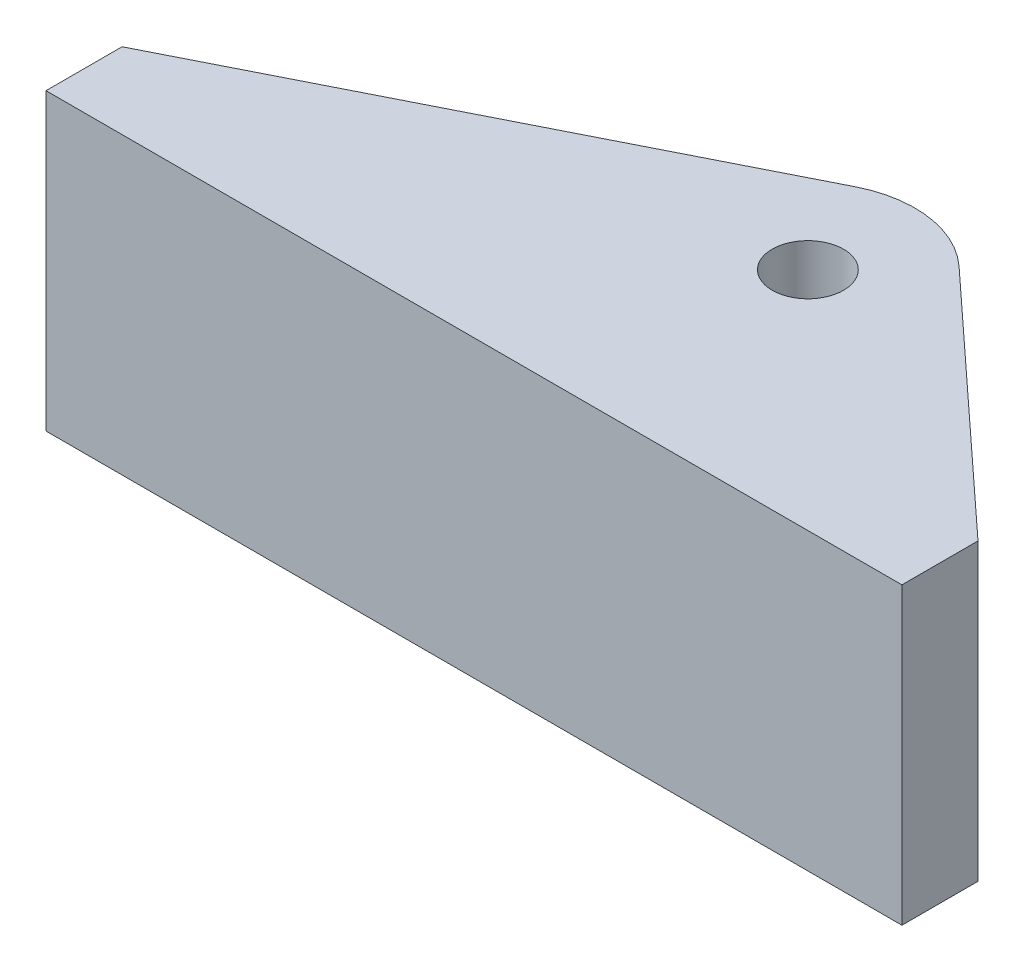
ISO-10303-21;
HEADER;
FILE_DESCRIPTION(('STEP AP214'),'2;1');
FILE_NAME('part.step','',(''),(''),'','','');
FILE_SCHEMA(('AUTOMOTIVE_DESIGN { 1 0 10303 214 1 1 1 1 }'));
ENDSEC;
DATA;
#1=APPLICATION_CONTEXT('core data for automotive mechanical design processes');
#2=APPLICATION_PROTOCOL_DEFINITION('international standard','automotive_design',2000,#1);
#3=PRODUCT_CONTEXT('',#1,'mechanical');
#4=PRODUCT('Part','Part','',(#3));
#5=PRODUCT_RELATED_PRODUCT_CATEGORY('part','',(#4));
#6=PRODUCT_DEFINITION_FORMATION('','',#4);
#7=PRODUCT_DEFINITION_CONTEXT('part definition',#1,'design');
#8=PRODUCT_DEFINITION('design','',#6,#7);
#9=PRODUCT_DEFINITION_SHAPE('','',#8);
#10=(LENGTH_UNIT() NAMED_UNIT(*) SI_UNIT(.MILLI.,.METRE.));
#11=(NAMED_UNIT(*) PLANE_ANGLE_UNIT() SI_UNIT($,.RADIAN.));
#12=(NAMED_UNIT(*) SI_UNIT($,.STERADIAN.) SOLID_ANGLE_UNIT());
#13=UNCERTAINTY_MEASURE_WITH_UNIT(LENGTH_MEASURE(1.E-05),#10,'distance_accuracy_value','');
#14=(GEOMETRIC_REPRESENTATION_CONTEXT(3) GLOBAL_UNCERTAINTY_ASSIGNED_CONTEXT((#13)) GLOBAL_UNIT_ASSIGNED_CONTEXT((#10,
#11,#12)) REPRESENTATION_CONTEXT('',''));
#15=CARTESIAN_POINT('',(0.,0.,0.));
#16=DIRECTION('',(0.,0.,1.));
#17=DIRECTION('',(1.,0.,0.));
#18=AXIS2_PLACEMENT_3D('',#15,#16,#17);
#19=CARTESIAN_POINT('',(0.,-19.685,0.));
#20=DIRECTION('',(-1.,0.,0.));
#21=DIRECTION('',(0.,0.,1.));
#22=AXIS2_PLACEMENT_3D('',#19,#20,#21);
#23=PLANE('',#22);
#24=DIRECTION('',(0.,0.,1.));
#25=VECTOR('',#24,1.);
#26=CARTESIAN_POINT('',(0.,0.,0.));
#27=LINE('',#26,#25);
#28=CARTESIAN_POINT('',(0.,0.,-5.08));
#29=VERTEX_POINT('',#28);
#30=CARTESIAN_POINT('',(0.,0.,0.));
#31=VERTEX_POINT('',#30);
#32=EDGE_CURVE('E136',#29,#31,#27,.T.);
#33=ORIENTED_EDGE('',*,*,#32,.F.);
#34=DIRECTION('',(0.,1.,0.));
#35=VECTOR('',#34,1.);
#36=CARTESIAN_POINT('',(0.,-19.685,-5.08));
#37=LINE('',#36,#35);
#38=CARTESIAN_POINT('',(0.,-19.685,-5.08));
#39=VERTEX_POINT('',#38);
#40=EDGE_CURVE('E11',#39,#29,#37,.T.);
#41=ORIENTED_EDGE('',*,*,#40,.F.);
#42=DIRECTION('',(0.,0.,1.));
#43=VECTOR('',#42,1.);
#44=CARTESIAN_POINT('',(0.,-19.685,0.));
#45=LINE('',#44,#43);
#46=CARTESIAN_POINT('',(0.,-19.685,0.));
#47=VERTEX_POINT('',#46);
#48=EDGE_CURVE('E157',#39,#47,#45,.T.);
#49=ORIENTED_EDGE('',*,*,#48,.T.);
#50=DIRECTION('',(0.,1.,0.));
#51=VECTOR('',#50,1.);
#52=CARTESIAN_POINT('',(0.,-19.685,0.));
#53=LINE('',#52,#51);
#54=EDGE_CURVE('E48',#47,#31,#53,.T.);
#55=ORIENTED_EDGE('',*,*,#54,.T.);
#56=EDGE_LOOP('',(#33,#41,#49,#55));
#57=FACE_BOUND('',#56,.T.);
#58=ADVANCED_FACE('F45',(#57),#23,.T.);
#59=CARTESIAN_POINT('',(0.,-19.685,-5.08));
#60=DIRECTION('',(-0.449272026723035,0.,-0.893395011181603));
#61=DIRECTION('',(-0.893395011181603,0.,0.449272026723035));
#62=AXIS2_PLACEMENT_3D('',#59,#60,#61);
#63=PLANE('',#62);
#64=DIRECTION('',(-0.893395011181603,0.,0.449272026723035));
#65=VECTOR('',#64,1.);
#66=CARTESIAN_POINT('',(0.,0.,-5.08));
#67=LINE('',#66,#65);
#68=CARTESIAN_POINT('',(32.5791129590973,0.,-21.4634406111286));
#69=VERTEX_POINT('',#68);
#70=EDGE_CURVE('E154',#69,#29,#67,.T.);
#71=ORIENTED_EDGE('',*,*,#70,.F.);
#72=DIRECTION('',(0.,1.,0.));
#73=VECTOR('',#72,1.);
#74=CARTESIAN_POINT('',(32.5791129590973,-19.685,-21.4634406111286));
#75=LINE('',#74,#73);
#76=CARTESIAN_POINT('',(32.5791129590973,-19.685,-21.4634406111286));
#77=VERTEX_POINT('',#76);
#78=EDGE_CURVE('E55',#77,#69,#75,.T.);
#79=ORIENTED_EDGE('',*,*,#78,.F.);
#80=DIRECTION('',(-0.893395011181603,0.,0.449272026723035));
#81=VECTOR('',#80,1.);
#82=CARTESIAN_POINT('',(0.,-19.685,-5.08));
#83=LINE('',#82,#81);
#84=EDGE_CURVE('E122',#77,#39,#83,.T.);
#85=ORIENTED_EDGE('',*,*,#84,.T.);
#86=ORIENTED_EDGE('',*,*,#40,.T.);
#87=EDGE_LOOP('',(#71,#79,#85,#86));
#88=FACE_BOUND('',#87,.T.);
#89=ADVANCED_FACE('F169',(#88),#63,.T.);
#90=CARTESIAN_POINT('',(35.7886,-19.685,-15.08125));
#91=DIRECTION('',(0.,1.,0.));
#92=DIRECTION('',(0.,0.,1.));
#93=AXIS2_PLACEMENT_3D('',#90,#91,#92);
#94=CYLINDRICAL_SURFACE('',#93,7.14374999999999);
#95=CARTESIAN_POINT('',(35.7886,0.,-15.08125));
#96=DIRECTION('',(0.,1.,0.));
#97=DIRECTION('',(0.,0.,1.));
#98=AXIS2_PLACEMENT_3D('',#95,#96,#97);
#99=CIRCLE('',#98,7.14374999999999);
#100=CARTESIAN_POINT('',(40.6349251662983,0.,-20.3297065774143));
#101=VERTEX_POINT('',#100);
#102=EDGE_CURVE('E108',#101,#69,#99,.T.);
#103=ORIENTED_EDGE('',*,*,#102,.F.);
#104=DIRECTION('',(0.,1.,0.));
#105=VECTOR('',#104,1.);
#106=CARTESIAN_POINT('',(40.6349251662983,-19.685,-20.3297065774143));
#107=LINE('',#106,#105);
#108=CARTESIAN_POINT('',(40.6349251662983,-19.685,-20.3297065774143));
#109=VERTEX_POINT('',#108);
#110=EDGE_CURVE('E103',#109,#101,#107,.T.);
#111=ORIENTED_EDGE('',*,*,#110,.F.);
#112=CARTESIAN_POINT('',(35.7886,-19.685,-15.08125));
#113=DIRECTION('',(0.,1.,0.));
#114=DIRECTION('',(0.,0.,1.));
#115=AXIS2_PLACEMENT_3D('',#112,#113,#114);
#116=CIRCLE('',#115,7.14374999999999);
#117=EDGE_CURVE('E106',#109,#77,#116,.T.);
#118=ORIENTED_EDGE('',*,*,#117,.T.);
#119=ORIENTED_EDGE('',*,*,#78,.T.);
#120=EDGE_LOOP('',(#103,#111,#118,#119));
#121=FACE_BOUND('',#120,.T.);
#122=ADVANCED_FACE('F105',(#121),#94,.T.);
#123=CARTESIAN_POINT('',(57.15,-19.685,-5.08));
#124=DIRECTION('',(0.678400723191365,0.,-0.734692084327463));
#125=DIRECTION('',(-0.734692084327463,0.,-0.678400723191365));
#126=AXIS2_PLACEMENT_3D('',#123,#124,#125);
#127=PLANE('',#126);
#128=DIRECTION('',(-0.734692084327463,0.,-0.678400723191365));
#129=VECTOR('',#128,1.);
#130=CARTESIAN_POINT('',(57.15,0.,-5.08));
#131=LINE('',#130,#129);
#132=CARTESIAN_POINT('',(57.15,0.,-5.08));
#133=VERTEX_POINT('',#132);
#134=EDGE_CURVE('E149',#133,#101,#131,.T.);
#135=ORIENTED_EDGE('',*,*,#134,.F.);
#136=DIRECTION('',(0.,1.,0.));
#137=VECTOR('',#136,1.);
#138=CARTESIAN_POINT('',(57.15,-19.685,-5.08));
#139=LINE('',#138,#137);
#140=CARTESIAN_POINT('',(57.15,-19.685,-5.08));
#141=VERTEX_POINT('',#140);
#142=EDGE_CURVE('E114',#141,#133,#139,.T.);
#143=ORIENTED_EDGE('',*,*,#142,.F.);
#144=DIRECTION('',(-0.734692084327463,0.,-0.678400723191365));
#145=VECTOR('',#144,1.);
#146=CARTESIAN_POINT('',(57.15,-19.685,-5.08));
#147=LINE('',#146,#145);
#148=EDGE_CURVE('E120',#141,#109,#147,.T.);
#149=ORIENTED_EDGE('',*,*,#148,.T.);
#150=ORIENTED_EDGE('',*,*,#110,.T.);
#151=EDGE_LOOP('',(#135,#143,#149,#150));
#152=FACE_BOUND('',#151,.T.);
#153=ADVANCED_FACE('F125',(#152),#127,.T.);
#154=CARTESIAN_POINT('',(57.15,-19.685,0.));
#155=DIRECTION('',(1.,0.,0.));
#156=DIRECTION('',(0.,0.,-1.));
#157=AXIS2_PLACEMENT_3D('',#154,#155,#156);
#158=PLANE('',#157);
#159=DIRECTION('',(0.,0.,-1.));
#160=VECTOR('',#159,1.);
#161=CARTESIAN_POINT('',(57.15,0.,0.));
#162=LINE('',#161,#160);
#163=CARTESIAN_POINT('',(57.15,0.,0.));
#164=VERTEX_POINT('',#163);
#165=EDGE_CURVE('E145',#164,#133,#162,.T.);
#166=ORIENTED_EDGE('',*,*,#165,.F.);
#167=DIRECTION('',(0.,1.,0.));
#168=VECTOR('',#167,1.);
#169=CARTESIAN_POINT('',(57.15,-19.685,0.));
#170=LINE('',#169,#168);
#171=CARTESIAN_POINT('',(57.15,-19.685,0.));
#172=VERTEX_POINT('',#171);
#173=EDGE_CURVE('E162',#172,#164,#170,.T.);
#174=ORIENTED_EDGE('',*,*,#173,.F.);
#175=DIRECTION('',(0.,0.,-1.));
#176=VECTOR('',#175,1.);
#177=CARTESIAN_POINT('',(57.15,-19.685,0.));
#178=LINE('',#177,#176);
#179=EDGE_CURVE('E127',#172,#141,#178,.T.);
#180=ORIENTED_EDGE('',*,*,#179,.T.);
#181=ORIENTED_EDGE('',*,*,#142,.T.);
#182=EDGE_LOOP('',(#166,#174,#180,#181));
#183=FACE_BOUND('',#182,.T.);
#184=ADVANCED_FACE('F182',(#183),#158,.T.);
#185=CARTESIAN_POINT('',(0.,-19.685,0.));
#186=DIRECTION('',(0.,0.,1.));
#187=DIRECTION('',(1.,0.,0.));
#188=AXIS2_PLACEMENT_3D('',#185,#186,#187);
#189=PLANE('',#188);
#190=DIRECTION('',(1.,0.,0.));
#191=VECTOR('',#190,1.);
#192=CARTESIAN_POINT('',(0.,0.,0.));
#193=LINE('',#192,#191);
#194=EDGE_CURVE('E140',#31,#164,#193,.T.);
#195=ORIENTED_EDGE('',*,*,#194,.F.);
#196=ORIENTED_EDGE('',*,*,#54,.F.);
#197=DIRECTION('',(1.,0.,0.));
#198=VECTOR('',#197,1.);
#199=CARTESIAN_POINT('',(0.,-19.685,0.));
#200=LINE('',#199,#198);
#201=EDGE_CURVE('E130',#47,#172,#200,.T.);
#202=ORIENTED_EDGE('',*,*,#201,.T.);
#203=ORIENTED_EDGE('',*,*,#173,.T.);
#204=EDGE_LOOP('',(#195,#196,#202,#203));
#205=FACE_BOUND('',#204,.T.);
#206=ADVANCED_FACE('F166',(#205),#189,.T.);
#207=CARTESIAN_POINT('',(35.7886,-19.685,-15.08125));
#208=DIRECTION('',(0.,1.,0.));
#209=DIRECTION('',(0.,0.,1.));
#210=AXIS2_PLACEMENT_3D('',#207,#208,#209);
#211=PLANE('',#210);
#212=CARTESIAN_POINT('',(35.7886,-19.685,-15.08125));
#213=DIRECTION('',(0.,1.,0.));
#214=DIRECTION('',(0.,0.,1.));
#215=AXIS2_PLACEMENT_3D('',#212,#213,#214);
#216=CIRCLE('',#215,2.38125);
#217=CARTESIAN_POINT('',(35.7886,-19.685,-12.7));
#218=VERTEX_POINT('',#217);
#219=EDGE_CURVE('E141',#218,#218,#216,.T.);
#220=ORIENTED_EDGE('',*,*,#219,.T.);
#221=EDGE_LOOP('',(#220));
#222=FACE_BOUND('',#221,.T.);
#223=ORIENTED_EDGE('',*,*,#48,.F.);
#224=ORIENTED_EDGE('',*,*,#84,.F.);
#225=ORIENTED_EDGE('',*,*,#117,.F.);
#226=ORIENTED_EDGE('',*,*,#148,.F.);
#227=ORIENTED_EDGE('',*,*,#179,.F.);
#228=ORIENTED_EDGE('',*,*,#201,.F.);
#229=EDGE_LOOP('',(#223,#224,#225,#226,#227,#228));
#230=FACE_BOUND('',#229,.T.);
#231=ADVANCED_FACE('F118',(#222,#230),#211,.F.);
#232=CARTESIAN_POINT('',(35.7886,0.,-15.08125));
#233=DIRECTION('',(0.,1.,0.));
#234=DIRECTION('',(0.,0.,1.));
#235=AXIS2_PLACEMENT_3D('',#232,#233,#234);
#236=PLANE('',#235);
#237=CARTESIAN_POINT('',(35.7886,0.,-15.08125));
#238=DIRECTION('',(0.,1.,0.));
#239=DIRECTION('',(0.,0.,1.));
#240=AXIS2_PLACEMENT_3D('',#237,#238,#239);
#241=CIRCLE('',#240,2.38125);
#242=CARTESIAN_POINT('',(35.7886,0.,-12.7));
#243=VERTEX_POINT('',#242);
#244=EDGE_CURVE('E205',#243,#243,#241,.T.);
#245=ORIENTED_EDGE('',*,*,#244,.F.);
#246=EDGE_LOOP('',(#245));
#247=FACE_BOUND('',#246,.T.);
#248=ORIENTED_EDGE('',*,*,#32,.T.);
#249=ORIENTED_EDGE('',*,*,#194,.T.);
#250=ORIENTED_EDGE('',*,*,#165,.T.);
#251=ORIENTED_EDGE('',*,*,#134,.T.);
#252=ORIENTED_EDGE('',*,*,#102,.T.);
#253=ORIENTED_EDGE('',*,*,#70,.T.);
#254=EDGE_LOOP('',(#248,#249,#250,#251,#252,#253));
#255=FACE_BOUND('',#254,.T.);
#256=ADVANCED_FACE('F168',(#247,#255),#236,.T.);
#257=CARTESIAN_POINT('',(35.7886,-19.685,-15.08125));
#258=DIRECTION('',(0.,1.,0.));
#259=DIRECTION('',(0.,0.,1.));
#260=AXIS2_PLACEMENT_3D('',#257,#258,#259);
#261=CYLINDRICAL_SURFACE('',#260,2.38125);
#262=ORIENTED_EDGE('',*,*,#219,.F.);
#263=EDGE_LOOP('',(#262));
#264=FACE_BOUND('',#263,.T.);
#265=ORIENTED_EDGE('',*,*,#244,.T.);
#266=EDGE_LOOP('',(#265));
#267=FACE_BOUND('',#266,.T.);
#268=ADVANCED_FACE('F193',(#264,#267),#261,.F.);
#269=CLOSED_SHELL('',(#58,#89,#122,#153,#184,#206,#231,#256,#268));
#270=MANIFOLD_SOLID_BREP('B2',#269);
#271=ADVANCED_BREP_SHAPE_REPRESENTATION('',(#18,#270),#14);
#272=SHAPE_DEFINITION_REPRESENTATION(#9,#271);
ENDSEC;
END-ISO-10303-21;
